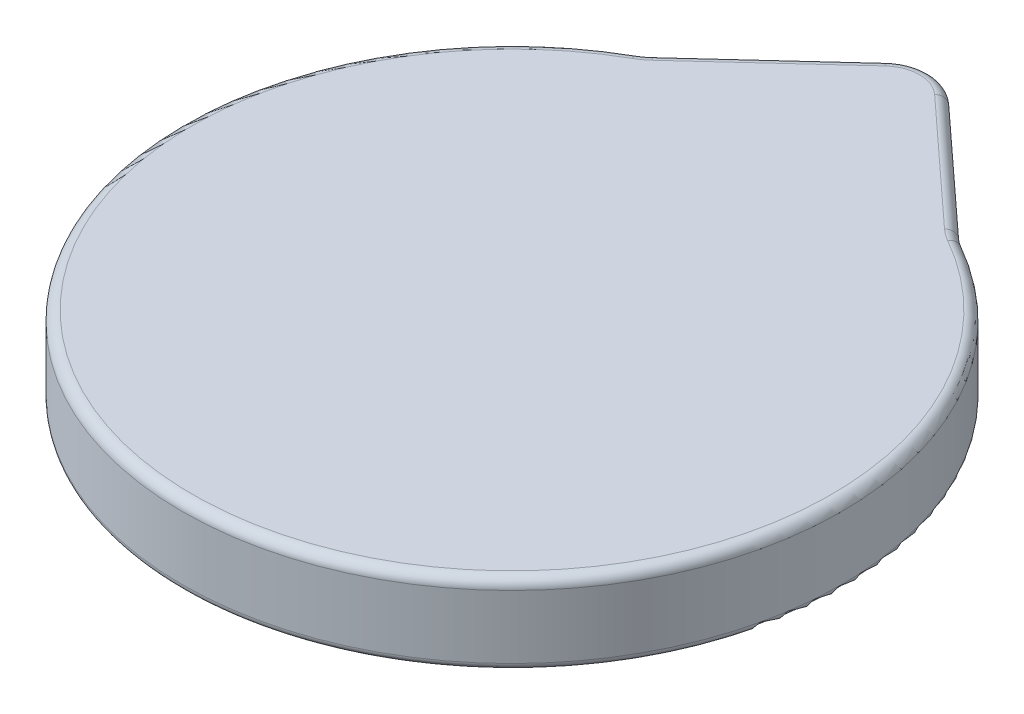
ISO-10303-21;
HEADER;
FILE_DESCRIPTION(('STEP AP214'),'2;1');
FILE_NAME('part.step','',(''),(''),'','','');
FILE_SCHEMA(('AUTOMOTIVE_DESIGN { 1 0 10303 214 1 1 1 1 }'));
ENDSEC;
DATA;
#1=APPLICATION_CONTEXT('core data for automotive mechanical design processes');
#2=APPLICATION_PROTOCOL_DEFINITION('international standard','automotive_design',2000,#1);
#3=PRODUCT_CONTEXT('',#1,'mechanical');
#4=PRODUCT('Part','Part','',(#3));
#5=PRODUCT_RELATED_PRODUCT_CATEGORY('part','',(#4));
#6=PRODUCT_DEFINITION_FORMATION('','',#4);
#7=PRODUCT_DEFINITION_CONTEXT('part definition',#1,'design');
#8=PRODUCT_DEFINITION('design','',#6,#7);
#9=PRODUCT_DEFINITION_SHAPE('','',#8);
#10=(LENGTH_UNIT() NAMED_UNIT(*) SI_UNIT(.MILLI.,.METRE.));
#11=(NAMED_UNIT(*) PLANE_ANGLE_UNIT() SI_UNIT($,.RADIAN.));
#12=(NAMED_UNIT(*) SI_UNIT($,.STERADIAN.) SOLID_ANGLE_UNIT());
#13=UNCERTAINTY_MEASURE_WITH_UNIT(LENGTH_MEASURE(1.E-05),#10,'distance_accuracy_value','');
#14=(GEOMETRIC_REPRESENTATION_CONTEXT(3) GLOBAL_UNCERTAINTY_ASSIGNED_CONTEXT((#13)) GLOBAL_UNIT_ASSIGNED_CONTEXT((#10,
#11,#12)) REPRESENTATION_CONTEXT('',''));
#15=CARTESIAN_POINT('',(0.,0.,0.));
#16=DIRECTION('',(0.,0.,1.));
#17=DIRECTION('',(1.,0.,0.));
#18=AXIS2_PLACEMENT_3D('',#15,#16,#17);
#19=CARTESIAN_POINT('',(-56.771821009574,-20.,-100.009801215965));
#20=DIRECTION('',(0.,1.,0.));
#21=DIRECTION('',(0.,0.,1.));
#22=AXIS2_PLACEMENT_3D('',#19,#20,#21);
#23=CYLINDRICAL_SURFACE('',#22,16.);
#24=DIRECTION('',(0.,1.,0.));
#25=VECTOR('',#24,1.);
#26=CARTESIAN_POINT('',(-45.9482804070128,-20.,-88.2262971180872));
#27=LINE('',#26,#25);
#28=CARTESIAN_POINT('',(-45.9482804070128,-18.,-88.2262971180872));
#29=VERTEX_POINT('',#28);
#30=CARTESIAN_POINT('',(-45.9482804070128,1.,-88.2262971180872));
#31=VERTEX_POINT('',#30);
#32=EDGE_CURVE('E292',#29,#31,#27,.T.);
#33=ORIENTED_EDGE('',*,*,#32,.F.);
#34=CARTESIAN_POINT('',(-56.771821009574,-18.,-100.009801215965));
#35=DIRECTION('',(0.,1.,0.));
#36=DIRECTION('',(0.,0.,1.));
#37=AXIS2_PLACEMENT_3D('',#34,#35,#36);
#38=CIRCLE('',#37,16.);
#39=CARTESIAN_POINT('',(-48.8731328691116,-18.,-86.0953940902658));
#40=VERTEX_POINT('',#39);
#41=EDGE_CURVE('E218',#29,#40,#38,.F.);
#42=ORIENTED_EDGE('',*,*,#41,.T.);
#43=DIRECTION('',(0.,1.,0.));
#44=VECTOR('',#43,1.);
#45=CARTESIAN_POINT('',(-48.8731328691116,-20.,-86.0953940902658));
#46=LINE('',#45,#44);
#47=CARTESIAN_POINT('',(-48.8731328691116,1.,-86.0953940902658));
#48=VERTEX_POINT('',#47);
#49=EDGE_CURVE('E312',#40,#48,#46,.T.);
#50=ORIENTED_EDGE('',*,*,#49,.T.);
#51=CARTESIAN_POINT('',(-56.771821009574,1.,-100.009801215965));
#52=DIRECTION('',(0.,1.,0.));
#53=DIRECTION('',(0.,0.,1.));
#54=AXIS2_PLACEMENT_3D('',#51,#52,#53);
#55=CIRCLE('',#54,16.);
#56=EDGE_CURVE('E298',#48,#31,#55,.T.);
#57=ORIENTED_EDGE('',*,*,#56,.T.);
#58=EDGE_LOOP('',(#33,#42,#50,#57));
#59=FACE_BOUND('',#58,.T.);
#60=ADVANCED_FACE('F37',(#59),#23,.F.);
#61=CARTESIAN_POINT('',(-9.4705980272411,-20.,-121.732262155761));
#62=DIRECTION('',(-0.676471287660074,0.,-0.73646900611738));
#63=DIRECTION('',(-0.73646900611738,0.,0.676471287660074));
#64=AXIS2_PLACEMENT_3D('',#61,#62,#63);
#65=PLANE('',#64);
#66=DIRECTION('',(0.,1.,0.));
#67=VECTOR('',#66,1.);
#68=CARTESIAN_POINT('',(-9.47059802724111,-20.,-121.732262155761));
#69=LINE('',#68,#67);
#70=CARTESIAN_POINT('',(-9.47059802724111,-18.,-121.732262155761));
#71=VERTEX_POINT('',#70);
#72=CARTESIAN_POINT('',(-9.47059802724111,1.,-121.732262155761));
#73=VERTEX_POINT('',#72);
#74=EDGE_CURVE('E206',#71,#73,#69,.T.);
#75=ORIENTED_EDGE('',*,*,#74,.F.);
#76=DIRECTION('',(-0.73646900611738,0.,0.676471287660074));
#77=VECTOR('',#76,1.);
#78=CARTESIAN_POINT('',(-45.9482804070128,-18.,-88.2262971180872));
#79=LINE('',#78,#77);
#80=EDGE_CURVE('E216',#71,#29,#79,.T.);
#81=ORIENTED_EDGE('',*,*,#80,.T.);
#82=ORIENTED_EDGE('',*,*,#32,.T.);
#83=DIRECTION('',(-0.73646900611738,0.,0.676471287660074));
#84=VECTOR('',#83,1.);
#85=CARTESIAN_POINT('',(-9.4705980272411,1.,-121.732262155761));
#86=LINE('',#85,#84);
#87=EDGE_CURVE('E372',#31,#73,#86,.F.);
#88=ORIENTED_EDGE('',*,*,#87,.T.);
#89=EDGE_LOOP('',(#75,#81,#82,#88));
#90=FACE_BOUND('',#89,.T.);
#91=ADVANCED_FACE('F290',(#90),#65,.T.);
#92=CARTESIAN_POINT('',(0.,-20.,-111.421696070118));
#93=DIRECTION('',(0.,1.,0.));
#94=DIRECTION('',(0.,0.,1.));
#95=AXIS2_PLACEMENT_3D('',#92,#93,#94);
#96=CYLINDRICAL_SURFACE('',#95,14.);
#97=DIRECTION('',(0.,1.,0.));
#98=VECTOR('',#97,1.);
#99=CARTESIAN_POINT('',(9.47059802724109,-20.,-121.732262155761));
#100=LINE('',#99,#98);
#101=CARTESIAN_POINT('',(9.47059802724109,-18.,-121.732262155761));
#102=VERTEX_POINT('',#101);
#103=CARTESIAN_POINT('',(9.47059802724109,1.,-121.732262155761));
#104=VERTEX_POINT('',#103);
#105=EDGE_CURVE('E194',#102,#104,#100,.T.);
#106=ORIENTED_EDGE('',*,*,#105,.F.);
#107=CARTESIAN_POINT('',(0.,-18.,-111.421696070118));
#108=DIRECTION('',(0.,1.,0.));
#109=DIRECTION('',(0.,0.,1.));
#110=AXIS2_PLACEMENT_3D('',#107,#108,#109);
#111=CIRCLE('',#110,14.);
#112=EDGE_CURVE('E198',#102,#71,#111,.T.);
#113=ORIENTED_EDGE('',*,*,#112,.T.);
#114=ORIENTED_EDGE('',*,*,#74,.T.);
#115=CARTESIAN_POINT('',(0.,1.,-111.421696070118));
#116=DIRECTION('',(0.,1.,0.));
#117=DIRECTION('',(0.,0.,1.));
#118=AXIS2_PLACEMENT_3D('',#115,#116,#117);
#119=CIRCLE('',#118,14.);
#120=EDGE_CURVE('E204',#73,#104,#119,.F.);
#121=ORIENTED_EDGE('',*,*,#120,.T.);
#122=EDGE_LOOP('',(#106,#113,#114,#121));
#123=FACE_BOUND('',#122,.T.);
#124=ADVANCED_FACE('F201',(#123),#96,.T.);
#125=CARTESIAN_POINT('',(9.47059802724109,-20.,-121.732262155761));
#126=DIRECTION('',(0.676471287660074,0.,-0.73646900611738));
#127=DIRECTION('',(-0.73646900611738,0.,-0.676471287660074));
#128=AXIS2_PLACEMENT_3D('',#125,#126,#127);
#129=PLANE('',#128);
#130=DIRECTION('',(0.,1.,0.));
#131=VECTOR('',#130,1.);
#132=CARTESIAN_POINT('',(45.9482804070129,-20.,-88.2262971180872));
#133=LINE('',#132,#131);
#134=CARTESIAN_POINT('',(45.9482804070129,-18.,-88.2262971180872));
#135=VERTEX_POINT('',#134);
#136=CARTESIAN_POINT('',(45.9482804070129,1.,-88.2262971180872));
#137=VERTEX_POINT('',#136);
#138=EDGE_CURVE('E196',#135,#137,#133,.T.);
#139=ORIENTED_EDGE('',*,*,#138,.F.);
#140=DIRECTION('',(-0.73646900611738,0.,-0.676471287660074));
#141=VECTOR('',#140,1.);
#142=CARTESIAN_POINT('',(9.47059802724109,-18.,-121.732262155761));
#143=LINE('',#142,#141);
#144=EDGE_CURVE('E190',#135,#102,#143,.T.);
#145=ORIENTED_EDGE('',*,*,#144,.T.);
#146=ORIENTED_EDGE('',*,*,#105,.T.);
#147=DIRECTION('',(0.73646900611738,0.,0.676471287660074));
#148=VECTOR('',#147,1.);
#149=CARTESIAN_POINT('',(9.47059802724109,1.,-121.732262155761));
#150=LINE('',#149,#148);
#151=EDGE_CURVE('E375',#104,#137,#150,.T.);
#152=ORIENTED_EDGE('',*,*,#151,.T.);
#153=EDGE_LOOP('',(#139,#145,#146,#152));
#154=FACE_BOUND('',#153,.T.);
#155=ADVANCED_FACE('F192',(#154),#129,.T.);
#156=CARTESIAN_POINT('',(56.7718210095741,-20.,-100.009801215965));
#157=DIRECTION('',(0.,1.,0.));
#158=DIRECTION('',(0.,0.,1.));
#159=AXIS2_PLACEMENT_3D('',#156,#157,#158);
#160=CYLINDRICAL_SURFACE('',#159,16.);
#161=DIRECTION('',(0.,1.,0.));
#162=VECTOR('',#161,1.);
#163=CARTESIAN_POINT('',(48.8731328691116,-20.,-86.0953940902657));
#164=LINE('',#163,#162);
#165=CARTESIAN_POINT('',(48.8731328691116,-18.,-86.0953940902657));
#166=VERTEX_POINT('',#165);
#167=CARTESIAN_POINT('',(48.8731328691116,1.,-86.0953940902657));
#168=VERTEX_POINT('',#167);
#169=EDGE_CURVE('E310',#166,#168,#164,.T.);
#170=ORIENTED_EDGE('',*,*,#169,.F.);
#171=CARTESIAN_POINT('',(56.7718210095741,-18.,-100.009801215965));
#172=DIRECTION('',(0.,1.,0.));
#173=DIRECTION('',(0.,0.,1.));
#174=AXIS2_PLACEMENT_3D('',#171,#172,#173);
#175=CIRCLE('',#174,16.);
#176=EDGE_CURVE('E197',#166,#135,#175,.F.);
#177=ORIENTED_EDGE('',*,*,#176,.T.);
#178=ORIENTED_EDGE('',*,*,#138,.T.);
#179=CARTESIAN_POINT('',(56.7718210095741,1.,-100.009801215965));
#180=DIRECTION('',(0.,1.,0.));
#181=DIRECTION('',(0.,0.,1.));
#182=AXIS2_PLACEMENT_3D('',#179,#180,#181);
#183=CIRCLE('',#182,16.);
#184=EDGE_CURVE('E377',#137,#168,#183,.T.);
#185=ORIENTED_EDGE('',*,*,#184,.T.);
#186=EDGE_LOOP('',(#170,#177,#178,#185));
#187=FACE_BOUND('',#186,.T.);
#188=ADVANCED_FACE('F741',(#187),#160,.F.);
#189=CARTESIAN_POINT('',(0.,-20.,0.));
#190=DIRECTION('',(0.,1.,0.));
#191=DIRECTION('',(0.,0.,1.));
#192=AXIS2_PLACEMENT_3D('',#189,#190,#191);
#193=CYLINDRICAL_SURFACE('',#192,99.);
#194=ORIENTED_EDGE('',*,*,#49,.F.);
#195=CARTESIAN_POINT('',(0.,-18.,0.));
#196=DIRECTION('',(0.,1.,0.));
#197=DIRECTION('',(0.,0.,1.));
#198=AXIS2_PLACEMENT_3D('',#195,#196,#197);
#199=CIRCLE('',#198,99.);
#200=EDGE_CURVE('E11',#40,#166,#199,.T.);
#201=ORIENTED_EDGE('',*,*,#200,.T.);
#202=ORIENTED_EDGE('',*,*,#169,.T.);
#203=CARTESIAN_POINT('',(0.,1.,0.));
#204=DIRECTION('',(0.,1.,0.));
#205=DIRECTION('',(0.,0.,1.));
#206=AXIS2_PLACEMENT_3D('',#203,#204,#205);
#207=CIRCLE('',#206,99.);
#208=EDGE_CURVE('E380',#168,#48,#207,.F.);
#209=ORIENTED_EDGE('',*,*,#208,.T.);
#210=EDGE_LOOP('',(#194,#201,#202,#209));
#211=FACE_BOUND('',#210,.T.);
#212=ADVANCED_FACE('F482',(#211),#193,.T.);
#213=CARTESIAN_POINT('',(56.7718210095741,-20.,-100.009801215965));
#214=DIRECTION('',(0.,1.,0.));
#215=DIRECTION('',(0.,0.,1.));
#216=AXIS2_PLACEMENT_3D('',#213,#214,#215);
#217=CYLINDRICAL_SURFACE('',#216,20.);
#218=DIRECTION('',(0.,1.,0.));
#219=VECTOR('',#218,1.);
#220=CARTESIAN_POINT('',(43.2423952563726,-20.,-85.2804210936177));
#221=LINE('',#220,#219);
#222=CARTESIAN_POINT('',(43.2423952563726,-18.,-85.2804210936177));
#223=VERTEX_POINT('',#222);
#224=CARTESIAN_POINT('',(43.2423952563726,-4.,-85.2804210936177));
#225=VERTEX_POINT('',#224);
#226=EDGE_CURVE('E306',#223,#225,#221,.T.);
#227=ORIENTED_EDGE('',*,*,#226,.F.);
#228=CARTESIAN_POINT('',(56.7718210095741,-18.,-100.009801215965));
#229=DIRECTION('',(0.,1.,0.));
#230=DIRECTION('',(0.,0.,1.));
#231=AXIS2_PLACEMENT_3D('',#228,#229,#230);
#232=CIRCLE('',#231,20.);
#233=CARTESIAN_POINT('',(46.898460833996,-18.,-82.6167923088409));
#234=VERTEX_POINT('',#233);
#235=EDGE_CURVE('E275',#223,#234,#232,.T.);
#236=ORIENTED_EDGE('',*,*,#235,.T.);
#237=DIRECTION('',(0.,1.,0.));
#238=VECTOR('',#237,1.);
#239=CARTESIAN_POINT('',(46.898460833996,-20.,-82.6167923088409));
#240=LINE('',#239,#238);
#241=CARTESIAN_POINT('',(46.898460833996,-4.,-82.6167923088409));
#242=VERTEX_POINT('',#241);
#243=EDGE_CURVE('E313',#234,#242,#240,.T.);
#244=ORIENTED_EDGE('',*,*,#243,.T.);
#245=CARTESIAN_POINT('',(56.7718210095741,-4.,-100.009801215965));
#246=DIRECTION('',(0.,1.,0.));
#247=DIRECTION('',(0.,0.,1.));
#248=AXIS2_PLACEMENT_3D('',#245,#246,#247);
#249=CIRCLE('',#248,20.);
#250=EDGE_CURVE('E336',#242,#225,#249,.F.);
#251=ORIENTED_EDGE('',*,*,#250,.T.);
#252=EDGE_LOOP('',(#227,#236,#244,#251));
#253=FACE_BOUND('',#252,.T.);
#254=ADVANCED_FACE('F408',(#253),#217,.T.);
#255=CARTESIAN_POINT('',(0.,-20.,0.));
#256=DIRECTION('',(0.,1.,0.));
#257=DIRECTION('',(0.,0.,1.));
#258=AXIS2_PLACEMENT_3D('',#255,#256,#257);
#259=CYLINDRICAL_SURFACE('',#258,95.);
#260=ORIENTED_EDGE('',*,*,#243,.F.);
#261=CARTESIAN_POINT('',(0.,-18.,0.));
#262=DIRECTION('',(0.,1.,0.));
#263=DIRECTION('',(0.,0.,1.));
#264=AXIS2_PLACEMENT_3D('',#261,#262,#263);
#265=CIRCLE('',#264,95.);
#266=CARTESIAN_POINT('',(-46.8984608339959,-18.,-82.6167923088409));
#267=VERTEX_POINT('',#266);
#268=EDGE_CURVE('E47',#234,#267,#265,.F.);
#269=ORIENTED_EDGE('',*,*,#268,.T.);
#270=DIRECTION('',(0.,1.,0.));
#271=VECTOR('',#270,1.);
#272=CARTESIAN_POINT('',(-46.8984608339959,-20.,-82.6167923088409));
#273=LINE('',#272,#271);
#274=CARTESIAN_POINT('',(-46.8984608339959,-4.,-82.6167923088409));
#275=VERTEX_POINT('',#274);
#276=EDGE_CURVE('E92',#267,#275,#273,.T.);
#277=ORIENTED_EDGE('',*,*,#276,.T.);
#278=CARTESIAN_POINT('',(0.,-4.,0.));
#279=DIRECTION('',(0.,1.,0.));
#280=DIRECTION('',(0.,0.,1.));
#281=AXIS2_PLACEMENT_3D('',#278,#279,#280);
#282=CIRCLE('',#281,95.);
#283=EDGE_CURVE('E339',#275,#242,#282,.T.);
#284=ORIENTED_EDGE('',*,*,#283,.T.);
#285=EDGE_LOOP('',(#260,#269,#277,#284));
#286=FACE_BOUND('',#285,.T.);
#287=ADVANCED_FACE('F409',(#286),#259,.F.);
#288=CARTESIAN_POINT('',(-56.771821009574,-20.,-100.009801215965));
#289=DIRECTION('',(0.,1.,0.));
#290=DIRECTION('',(0.,0.,1.));
#291=AXIS2_PLACEMENT_3D('',#288,#289,#290);
#292=CYLINDRICAL_SURFACE('',#291,20.);
#293=ORIENTED_EDGE('',*,*,#276,.F.);
#294=CARTESIAN_POINT('',(-56.771821009574,-18.,-100.009801215965));
#295=DIRECTION('',(0.,1.,0.));
#296=DIRECTION('',(0.,0.,1.));
#297=AXIS2_PLACEMENT_3D('',#294,#295,#296);
#298=CIRCLE('',#297,20.);
#299=CARTESIAN_POINT('',(-43.2423952563726,-18.,-85.2804210936177));
#300=VERTEX_POINT('',#299);
#301=EDGE_CURVE('E383',#267,#300,#298,.T.);
#302=ORIENTED_EDGE('',*,*,#301,.T.);
#303=DIRECTION('',(0.,1.,0.));
#304=VECTOR('',#303,1.);
#305=CARTESIAN_POINT('',(-43.2423952563726,-20.,-85.2804210936177));
#306=LINE('',#305,#304);
#307=CARTESIAN_POINT('',(-43.2423952563726,-4.,-85.2804210936177));
#308=VERTEX_POINT('',#307);
#309=EDGE_CURVE('E426',#300,#308,#306,.T.);
#310=ORIENTED_EDGE('',*,*,#309,.T.);
#311=CARTESIAN_POINT('',(-56.771821009574,-4.,-100.009801215965));
#312=DIRECTION('',(0.,1.,0.));
#313=DIRECTION('',(0.,0.,1.));
#314=AXIS2_PLACEMENT_3D('',#311,#312,#313);
#315=CIRCLE('',#314,20.);
#316=EDGE_CURVE('E299',#308,#275,#315,.F.);
#317=ORIENTED_EDGE('',*,*,#316,.T.);
#318=EDGE_LOOP('',(#293,#302,#310,#317));
#319=FACE_BOUND('',#318,.T.);
#320=ADVANCED_FACE('F425',(#319),#292,.T.);
#321=CARTESIAN_POINT('',(-6.76471287660079,-20.,-118.786386131292));
#322=DIRECTION('',(-0.676471287660074,0.,-0.73646900611738));
#323=DIRECTION('',(-0.73646900611738,0.,0.676471287660074));
#324=AXIS2_PLACEMENT_3D('',#321,#322,#323);
#325=PLANE('',#324);
#326=ORIENTED_EDGE('',*,*,#309,.F.);
#327=DIRECTION('',(-0.73646900611738,0.,0.676471287660074));
#328=VECTOR('',#327,1.);
#329=CARTESIAN_POINT('',(-6.76471287660079,-18.,-118.786386131292));
#330=LINE('',#329,#328);
#331=CARTESIAN_POINT('',(-6.76471287660079,-18.,-118.786386131292));
#332=VERTEX_POINT('',#331);
#333=EDGE_CURVE('E400',#300,#332,#330,.F.);
#334=ORIENTED_EDGE('',*,*,#333,.T.);
#335=DIRECTION('',(0.,1.,0.));
#336=VECTOR('',#335,1.);
#337=CARTESIAN_POINT('',(-6.76471287660079,-20.,-118.786386131292));
#338=LINE('',#337,#336);
#339=CARTESIAN_POINT('',(-6.76471287660079,-4.,-118.786386131292));
#340=VERTEX_POINT('',#339);
#341=EDGE_CURVE('E432',#332,#340,#338,.T.);
#342=ORIENTED_EDGE('',*,*,#341,.T.);
#343=DIRECTION('',(-0.73646900611738,0.,0.676471287660074));
#344=VECTOR('',#343,1.);
#345=CARTESIAN_POINT('',(-43.2423952563726,-4.,-85.2804210936177));
#346=LINE('',#345,#344);
#347=EDGE_CURVE('E327',#340,#308,#346,.T.);
#348=ORIENTED_EDGE('',*,*,#347,.T.);
#349=EDGE_LOOP('',(#326,#334,#342,#348));
#350=FACE_BOUND('',#349,.T.);
#351=ADVANCED_FACE('F428',(#350),#325,.F.);
#352=CARTESIAN_POINT('',(0.,-20.,-111.421696070118));
#353=DIRECTION('',(0.,1.,0.));
#354=DIRECTION('',(0.,0.,1.));
#355=AXIS2_PLACEMENT_3D('',#352,#353,#354);
#356=CYLINDRICAL_SURFACE('',#355,10.);
#357=ORIENTED_EDGE('',*,*,#341,.F.);
#358=CARTESIAN_POINT('',(0.,-18.,-111.421696070118));
#359=DIRECTION('',(0.,1.,0.));
#360=DIRECTION('',(0.,0.,1.));
#361=AXIS2_PLACEMENT_3D('',#358,#359,#360);
#362=CIRCLE('',#361,10.);
#363=CARTESIAN_POINT('',(6.76471287660079,-18.,-118.786386131292));
#364=VERTEX_POINT('',#363);
#365=EDGE_CURVE('E402',#332,#364,#362,.F.);
#366=ORIENTED_EDGE('',*,*,#365,.T.);
#367=DIRECTION('',(0.,1.,0.));
#368=VECTOR('',#367,1.);
#369=CARTESIAN_POINT('',(6.76471287660079,-20.,-118.786386131292));
#370=LINE('',#369,#368);
#371=CARTESIAN_POINT('',(6.76471287660079,-4.,-118.786386131292));
#372=VERTEX_POINT('',#371);
#373=EDGE_CURVE('E435',#364,#372,#370,.T.);
#374=ORIENTED_EDGE('',*,*,#373,.T.);
#375=CARTESIAN_POINT('',(0.,-4.,-111.421696070118));
#376=DIRECTION('',(0.,1.,0.));
#377=DIRECTION('',(0.,0.,1.));
#378=AXIS2_PLACEMENT_3D('',#375,#376,#377);
#379=CIRCLE('',#378,10.);
#380=EDGE_CURVE('E330',#372,#340,#379,.T.);
#381=ORIENTED_EDGE('',*,*,#380,.T.);
#382=EDGE_LOOP('',(#357,#366,#374,#381));
#383=FACE_BOUND('',#382,.T.);
#384=ADVANCED_FACE('F460',(#383),#356,.F.);
#385=CARTESIAN_POINT('',(6.76471287660079,-20.,-118.786386131292));
#386=DIRECTION('',(0.676471287660074,0.,-0.73646900611738));
#387=DIRECTION('',(-0.73646900611738,0.,-0.676471287660074));
#388=AXIS2_PLACEMENT_3D('',#385,#386,#387);
#389=PLANE('',#388);
#390=ORIENTED_EDGE('',*,*,#373,.F.);
#391=DIRECTION('',(-0.73646900611738,0.,-0.676471287660074));
#392=VECTOR('',#391,1.);
#393=CARTESIAN_POINT('',(6.76471287660079,-18.,-118.786386131292));
#394=LINE('',#393,#392);
#395=EDGE_CURVE('E279',#364,#223,#394,.F.);
#396=ORIENTED_EDGE('',*,*,#395,.T.);
#397=ORIENTED_EDGE('',*,*,#226,.T.);
#398=DIRECTION('',(-0.73646900611738,0.,-0.676471287660074));
#399=VECTOR('',#398,1.);
#400=CARTESIAN_POINT('',(6.76471287660079,-4.,-118.786386131292));
#401=LINE('',#400,#399);
#402=EDGE_CURVE('E333',#225,#372,#401,.T.);
#403=ORIENTED_EDGE('',*,*,#402,.T.);
#404=EDGE_LOOP('',(#390,#396,#397,#403));
#405=FACE_BOUND('',#404,.T.);
#406=ADVANCED_FACE('F440',(#405),#389,.F.);
#407=CARTESIAN_POINT('',(-56.771821009574,0.,-100.009801215965));
#408=DIRECTION('',(0.,1.,0.));
#409=DIRECTION('',(0.,0.,1.));
#410=AXIS2_PLACEMENT_3D('',#407,#408,#409);
#411=PLANE('',#410);
#412=CARTESIAN_POINT('',(0.,0.,0.));
#413=DIRECTION('',(0.,1.,0.));
#414=DIRECTION('',(0.,0.,1.));
#415=AXIS2_PLACEMENT_3D('',#412,#413,#414);
#416=CIRCLE('',#415,91.);
#417=CARTESIAN_POINT('',(44.9237887988804,0.,-79.138190527416));
#418=VERTEX_POINT('',#417);
#419=CARTESIAN_POINT('',(-44.9237887988803,0.,-79.138190527416));
#420=VERTEX_POINT('',#419);
#421=EDGE_CURVE('E302',#418,#420,#416,.F.);
#422=ORIENTED_EDGE('',*,*,#421,.T.);
#423=CARTESIAN_POINT('',(-56.771821009574,0.,-100.009801215965));
#424=DIRECTION('',(0.,1.,0.));
#425=DIRECTION('',(0.,0.,1.));
#426=AXIS2_PLACEMENT_3D('',#423,#424,#425);
#427=CIRCLE('',#426,24.);
#428=CARTESIAN_POINT('',(-40.5365101057323,0.,-82.3345450691481));
#429=VERTEX_POINT('',#428);
#430=EDGE_CURVE('E324',#420,#429,#427,.T.);
#431=ORIENTED_EDGE('',*,*,#430,.T.);
#432=DIRECTION('',(-0.73646900611738,0.,0.676471287660074));
#433=VECTOR('',#432,1.);
#434=CARTESIAN_POINT('',(-4.05882772596049,0.,-115.840510106822));
#435=LINE('',#434,#433);
#436=CARTESIAN_POINT('',(-4.0588277259605,0.,-115.840510106822));
#437=VERTEX_POINT('',#436);
#438=EDGE_CURVE('E322',#429,#437,#435,.F.);
#439=ORIENTED_EDGE('',*,*,#438,.T.);
#440=CARTESIAN_POINT('',(0.,0.,-111.421696070118));
#441=DIRECTION('',(0.,1.,0.));
#442=DIRECTION('',(0.,0.,1.));
#443=AXIS2_PLACEMENT_3D('',#440,#441,#442);
#444=CIRCLE('',#443,6.);
#445=CARTESIAN_POINT('',(4.05882772596047,0.,-115.840510106822));
#446=VERTEX_POINT('',#445);
#447=EDGE_CURVE('E320',#437,#446,#444,.F.);
#448=ORIENTED_EDGE('',*,*,#447,.T.);
#449=DIRECTION('',(-0.73646900611738,0.,-0.676471287660074));
#450=VECTOR('',#449,1.);
#451=CARTESIAN_POINT('',(40.5365101057323,0.,-82.3345450691481));
#452=LINE('',#451,#450);
#453=CARTESIAN_POINT('',(40.5365101057323,0.,-82.3345450691481));
#454=VERTEX_POINT('',#453);
#455=EDGE_CURVE('E318',#446,#454,#452,.F.);
#456=ORIENTED_EDGE('',*,*,#455,.T.);
#457=CARTESIAN_POINT('',(56.7718210095741,0.,-100.009801215965));
#458=DIRECTION('',(0.,1.,0.));
#459=DIRECTION('',(0.,0.,1.));
#460=AXIS2_PLACEMENT_3D('',#457,#458,#459);
#461=CIRCLE('',#460,24.);
#462=EDGE_CURVE('E316',#454,#418,#461,.T.);
#463=ORIENTED_EDGE('',*,*,#462,.T.);
#464=EDGE_LOOP('',(#422,#431,#439,#448,#456,#463));
#465=FACE_BOUND('',#464,.T.);
#466=ADVANCED_FACE('F454',(#465),#411,.F.);
#467=CARTESIAN_POINT('',(-56.771821009574,4.,-100.009801215965));
#468=DIRECTION('',(0.,1.,0.));
#469=DIRECTION('',(0.,0.,1.));
#470=AXIS2_PLACEMENT_3D('',#467,#468,#469);
#471=PLANE('',#470);
#472=DIRECTION('',(-0.73646900611738,0.,0.676471287660074));
#473=VECTOR('',#472,1.);
#474=CARTESIAN_POINT('',(-43.9188665440326,4.,-86.0168900997351));
#475=LINE('',#474,#473);
#476=CARTESIAN_POINT('',(-7.44118416426088,4.,-119.522855137409));
#477=VERTEX_POINT('',#476);
#478=CARTESIAN_POINT('',(-43.9188665440326,4.,-86.0168900997351));
#479=VERTEX_POINT('',#478);
#480=EDGE_CURVE('E367',#477,#479,#475,.T.);
#481=ORIENTED_EDGE('',*,*,#480,.T.);
#482=CARTESIAN_POINT('',(-56.771821009574,4.,-100.009801215965));
#483=DIRECTION('',(0.,1.,0.));
#484=DIRECTION('',(0.,0.,1.));
#485=AXIS2_PLACEMENT_3D('',#482,#483,#484);
#486=CIRCLE('',#485,19.);
#487=CARTESIAN_POINT('',(-47.3921288427749,4.,-83.4864427541971));
#488=VERTEX_POINT('',#487);
#489=EDGE_CURVE('E369',#479,#488,#486,.F.);
#490=ORIENTED_EDGE('',*,*,#489,.T.);
#491=CARTESIAN_POINT('',(0.,4.,0.));
#492=DIRECTION('',(0.,1.,0.));
#493=DIRECTION('',(0.,0.,1.));
#494=AXIS2_PLACEMENT_3D('',#491,#492,#493);
#495=CIRCLE('',#494,96.);
#496=CARTESIAN_POINT('',(47.3921288427749,4.,-83.4864427541971));
#497=VERTEX_POINT('',#496);
#498=EDGE_CURVE('E359',#488,#497,#495,.T.);
#499=ORIENTED_EDGE('',*,*,#498,.T.);
#500=CARTESIAN_POINT('',(56.7718210095741,4.,-100.009801215965));
#501=DIRECTION('',(0.,1.,0.));
#502=DIRECTION('',(0.,0.,1.));
#503=AXIS2_PLACEMENT_3D('',#500,#501,#502);
#504=CIRCLE('',#503,19.);
#505=CARTESIAN_POINT('',(43.9188665440327,4.,-86.0168900997351));
#506=VERTEX_POINT('',#505);
#507=EDGE_CURVE('E361',#497,#506,#504,.F.);
#508=ORIENTED_EDGE('',*,*,#507,.T.);
#509=DIRECTION('',(0.73646900611738,0.,0.676471287660074));
#510=VECTOR('',#509,1.);
#511=CARTESIAN_POINT('',(-17.6656830584857,4.,-142.584348096659));
#512=LINE('',#511,#510);
#513=CARTESIAN_POINT('',(7.44118416426086,4.,-119.522855137409));
#514=VERTEX_POINT('',#513);
#515=EDGE_CURVE('E363',#506,#514,#512,.F.);
#516=ORIENTED_EDGE('',*,*,#515,.T.);
#517=CARTESIAN_POINT('',(0.,4.,-111.421696070118));
#518=DIRECTION('',(0.,1.,0.));
#519=DIRECTION('',(0.,0.,1.));
#520=AXIS2_PLACEMENT_3D('',#517,#518,#519);
#521=CIRCLE('',#520,11.);
#522=EDGE_CURVE('E365',#514,#477,#521,.T.);
#523=ORIENTED_EDGE('',*,*,#522,.T.);
#524=EDGE_LOOP('',(#481,#490,#499,#508,#516,#523));
#525=FACE_BOUND('',#524,.T.);
#526=ADVANCED_FACE('F503',(#525),#471,.T.);
#527=CARTESIAN_POINT('',(4.0588277259605,-4.,-115.840510106822));
#528=DIRECTION('',(0.73646900611738,0.,0.676471287660074));
#529=DIRECTION('',(0.676471287660074,0.,-0.73646900611738));
#530=AXIS2_PLACEMENT_3D('',#527,#528,#529);
#531=CYLINDRICAL_SURFACE('',#530,4.);
#532=CARTESIAN_POINT('',(40.5365101057323,-4.,-82.3345450691481));
#533=DIRECTION('',(-0.73646900611738,0.,-0.676471287660074));
#534=DIRECTION('',(-0.676471287660074,0.,0.73646900611738));
#535=AXIS2_PLACEMENT_3D('',#532,#533,#534);
#536=CIRCLE('',#535,4.);
#537=EDGE_CURVE('E352',#454,#225,#536,.T.);
#538=ORIENTED_EDGE('',*,*,#537,.F.);
#539=ORIENTED_EDGE('',*,*,#455,.F.);
#540=CARTESIAN_POINT('',(4.0588277259605,-4.,-115.840510106822));
#541=DIRECTION('',(0.73646900611738,0.,0.676471287660074));
#542=DIRECTION('',(0.676471287660074,0.,-0.73646900611738));
#543=AXIS2_PLACEMENT_3D('',#540,#541,#542);
#544=CIRCLE('',#543,4.);
#545=EDGE_CURVE('E355',#372,#446,#544,.T.);
#546=ORIENTED_EDGE('',*,*,#545,.F.);
#547=ORIENTED_EDGE('',*,*,#402,.F.);
#548=EDGE_LOOP('',(#538,#539,#546,#547));
#549=FACE_BOUND('',#548,.T.);
#550=ADVANCED_FACE('F447',(#549),#531,.F.);
#551=CARTESIAN_POINT('',(0.,-4.,-111.421696070118));
#552=DIRECTION('',(0.,1.,0.));
#553=DIRECTION('',(0.,0.,1.));
#554=AXIS2_PLACEMENT_3D('',#551,#552,#553);
#555=TOROIDAL_SURFACE('',#554,6.,4.);
#556=ORIENTED_EDGE('',*,*,#545,.T.);
#557=ORIENTED_EDGE('',*,*,#447,.F.);
#558=CARTESIAN_POINT('',(-4.05882772596047,-4.,-115.840510106822));
#559=DIRECTION('',(0.736469006117375,0.,-0.67647128766008));
#560=DIRECTION('',(-0.67647128766008,0.,-0.736469006117375));
#561=AXIS2_PLACEMENT_3D('',#558,#559,#560);
#562=CIRCLE('',#561,4.);
#563=EDGE_CURVE('E349',#340,#437,#562,.T.);
#564=ORIENTED_EDGE('',*,*,#563,.F.);
#565=ORIENTED_EDGE('',*,*,#380,.F.);
#566=EDGE_LOOP('',(#556,#557,#564,#565));
#567=FACE_BOUND('',#566,.T.);
#568=ADVANCED_FACE('F458',(#567),#555,.F.);
#569=CARTESIAN_POINT('',(56.7718210095741,-4.,-100.009801215965));
#570=DIRECTION('',(0.,1.,0.));
#571=DIRECTION('',(0.,0.,1.));
#572=AXIS2_PLACEMENT_3D('',#569,#570,#571);
#573=TOROIDAL_SURFACE('',#572,24.,4.);
#574=ORIENTED_EDGE('',*,*,#537,.T.);
#575=ORIENTED_EDGE('',*,*,#250,.F.);
#576=CARTESIAN_POINT('',(44.9237887988804,-4.,-79.138190527416));
#577=DIRECTION('',(-0.869650445356221,0.,-0.493668008778902));
#578=DIRECTION('',(-0.493668008778902,0.,0.869650445356221));
#579=AXIS2_PLACEMENT_3D('',#576,#577,#578);
#580=CIRCLE('',#579,4.);
#581=EDGE_CURVE('E346',#418,#242,#580,.T.);
#582=ORIENTED_EDGE('',*,*,#581,.F.);
#583=ORIENTED_EDGE('',*,*,#462,.F.);
#584=EDGE_LOOP('',(#574,#575,#582,#583));
#585=FACE_BOUND('',#584,.T.);
#586=ADVANCED_FACE('F451',(#585),#573,.F.);
#587=CARTESIAN_POINT('',(-4.05882772596049,-4.,-115.840510106822));
#588=DIRECTION('',(0.73646900611738,0.,-0.676471287660074));
#589=DIRECTION('',(-0.676471287660074,0.,-0.73646900611738));
#590=AXIS2_PLACEMENT_3D('',#587,#588,#589);
#591=CYLINDRICAL_SURFACE('',#590,4.);
#592=ORIENTED_EDGE('',*,*,#563,.T.);
#593=ORIENTED_EDGE('',*,*,#438,.F.);
#594=CARTESIAN_POINT('',(-40.5365101057323,-4.,-82.3345450691481));
#595=DIRECTION('',(0.73646900611738,0.,-0.676471287660074));
#596=DIRECTION('',(-0.676471287660074,0.,-0.73646900611738));
#597=AXIS2_PLACEMENT_3D('',#594,#595,#596);
#598=CIRCLE('',#597,4.);
#599=EDGE_CURVE('E343',#308,#429,#598,.T.);
#600=ORIENTED_EDGE('',*,*,#599,.F.);
#601=ORIENTED_EDGE('',*,*,#347,.F.);
#602=EDGE_LOOP('',(#592,#593,#600,#601));
#603=FACE_BOUND('',#602,.T.);
#604=ADVANCED_FACE('F492',(#603),#591,.F.);
#605=CARTESIAN_POINT('',(0.,-4.,0.));
#606=DIRECTION('',(0.,1.,0.));
#607=DIRECTION('',(0.,0.,1.));
#608=AXIS2_PLACEMENT_3D('',#605,#606,#607);
#609=TOROIDAL_SURFACE('',#608,91.,4.);
#610=ORIENTED_EDGE('',*,*,#581,.T.);
#611=ORIENTED_EDGE('',*,*,#283,.F.);
#612=CARTESIAN_POINT('',(-44.9237887988803,-4.,-79.138190527416));
#613=DIRECTION('',(-0.86965044535622,0.,0.493668008778905));
#614=DIRECTION('',(0.493668008778905,0.,0.86965044535622));
#615=AXIS2_PLACEMENT_3D('',#612,#613,#614);
#616=CIRCLE('',#615,4.);
#617=EDGE_CURVE('E341',#420,#275,#616,.T.);
#618=ORIENTED_EDGE('',*,*,#617,.F.);
#619=ORIENTED_EDGE('',*,*,#421,.F.);
#620=EDGE_LOOP('',(#610,#611,#618,#619));
#621=FACE_BOUND('',#620,.T.);
#622=ADVANCED_FACE('F488',(#621),#609,.F.);
#623=CARTESIAN_POINT('',(-56.771821009574,-4.,-100.009801215965));
#624=DIRECTION('',(0.,1.,0.));
#625=DIRECTION('',(0.,0.,1.));
#626=AXIS2_PLACEMENT_3D('',#623,#624,#625);
#627=TOROIDAL_SURFACE('',#626,24.,4.);
#628=ORIENTED_EDGE('',*,*,#599,.T.);
#629=ORIENTED_EDGE('',*,*,#430,.F.);
#630=ORIENTED_EDGE('',*,*,#617,.T.);
#631=ORIENTED_EDGE('',*,*,#316,.F.);
#632=EDGE_LOOP('',(#628,#629,#630,#631));
#633=FACE_BOUND('',#632,.T.);
#634=ADVANCED_FACE('F484',(#633),#627,.F.);
#635=CARTESIAN_POINT('',(7.44118416426087,1.,-119.522855137409));
#636=DIRECTION('',(0.73646900611738,0.,0.676471287660074));
#637=DIRECTION('',(0.676471287660074,0.,-0.73646900611738));
#638=AXIS2_PLACEMENT_3D('',#635,#636,#637);
#639=CYLINDRICAL_SURFACE('',#638,3.);
#640=CARTESIAN_POINT('',(7.44118416426086,1.,-119.522855137409));
#641=DIRECTION('',(-0.736469006117379,0.,-0.676471287660075));
#642=DIRECTION('',(-0.676471287660075,0.,0.736469006117379));
#643=AXIS2_PLACEMENT_3D('',#640,#641,#642);
#644=CIRCLE('',#643,3.);
#645=EDGE_CURVE('E393',#514,#104,#644,.T.);
#646=ORIENTED_EDGE('',*,*,#645,.F.);
#647=ORIENTED_EDGE('',*,*,#515,.F.);
#648=CARTESIAN_POINT('',(43.9188665440327,1.,-86.0168900997351));
#649=DIRECTION('',(0.736469006117379,0.,0.676471287660075));
#650=DIRECTION('',(0.676471287660075,0.,-0.736469006117379));
#651=AXIS2_PLACEMENT_3D('',#648,#649,#650);
#652=CIRCLE('',#651,3.);
#653=EDGE_CURVE('E344',#137,#506,#652,.T.);
#654=ORIENTED_EDGE('',*,*,#653,.F.);
#655=ORIENTED_EDGE('',*,*,#151,.F.);
#656=EDGE_LOOP('',(#646,#647,#654,#655));
#657=FACE_BOUND('',#656,.T.);
#658=ADVANCED_FACE('F487',(#657),#639,.T.);
#659=CARTESIAN_POINT('',(56.7718210095741,1.,-100.009801215965));
#660=DIRECTION('',(0.,1.,0.));
#661=DIRECTION('',(0.,0.,1.));
#662=AXIS2_PLACEMENT_3D('',#659,#660,#661);
#663=TOROIDAL_SURFACE('',#662,19.,3.);
#664=ORIENTED_EDGE('',*,*,#653,.T.);
#665=ORIENTED_EDGE('',*,*,#507,.F.);
#666=CARTESIAN_POINT('',(47.3921288427749,1.,-83.4864427541971));
#667=DIRECTION('',(0.869650445356222,0.,0.493668008778901));
#668=DIRECTION('',(0.493668008778901,0.,-0.869650445356222));
#669=AXIS2_PLACEMENT_3D('',#666,#667,#668);
#670=CIRCLE('',#669,3.);
#671=EDGE_CURVE('E390',#168,#497,#670,.T.);
#672=ORIENTED_EDGE('',*,*,#671,.F.);
#673=ORIENTED_EDGE('',*,*,#184,.F.);
#674=EDGE_LOOP('',(#664,#665,#672,#673));
#675=FACE_BOUND('',#674,.T.);
#676=ADVANCED_FACE('F519',(#675),#663,.T.);
#677=CARTESIAN_POINT('',(0.,1.,-111.421696070118));
#678=DIRECTION('',(0.,1.,0.));
#679=DIRECTION('',(0.,0.,1.));
#680=AXIS2_PLACEMENT_3D('',#677,#678,#679);
#681=TOROIDAL_SURFACE('',#680,11.,3.);
#682=ORIENTED_EDGE('',*,*,#645,.T.);
#683=ORIENTED_EDGE('',*,*,#120,.F.);
#684=CARTESIAN_POINT('',(-7.44118416426088,1.,-119.522855137409));
#685=DIRECTION('',(-0.73646900611738,0.,0.676471287660074));
#686=DIRECTION('',(0.676471287660074,0.,0.73646900611738));
#687=AXIS2_PLACEMENT_3D('',#684,#685,#686);
#688=CIRCLE('',#687,3.);
#689=EDGE_CURVE('E387',#477,#73,#688,.T.);
#690=ORIENTED_EDGE('',*,*,#689,.F.);
#691=ORIENTED_EDGE('',*,*,#522,.F.);
#692=EDGE_LOOP('',(#682,#683,#690,#691));
#693=FACE_BOUND('',#692,.T.);
#694=ADVANCED_FACE('F515',(#693),#681,.T.);
#695=CARTESIAN_POINT('',(0.,1.,0.));
#696=DIRECTION('',(0.,1.,0.));
#697=DIRECTION('',(0.,0.,1.));
#698=AXIS2_PLACEMENT_3D('',#695,#696,#697);
#699=TOROIDAL_SURFACE('',#698,96.,3.);
#700=ORIENTED_EDGE('',*,*,#671,.T.);
#701=ORIENTED_EDGE('',*,*,#498,.F.);
#702=CARTESIAN_POINT('',(-47.3921288427749,1.,-83.4864427541971));
#703=DIRECTION('',(0.86965044535622,0.,-0.493668008778904));
#704=DIRECTION('',(-0.493668008778904,0.,-0.86965044535622));
#705=AXIS2_PLACEMENT_3D('',#702,#703,#704);
#706=CIRCLE('',#705,3.);
#707=EDGE_CURVE('E385',#48,#488,#706,.T.);
#708=ORIENTED_EDGE('',*,*,#707,.F.);
#709=ORIENTED_EDGE('',*,*,#208,.F.);
#710=EDGE_LOOP('',(#700,#701,#708,#709));
#711=FACE_BOUND('',#710,.T.);
#712=ADVANCED_FACE('F511',(#711),#699,.T.);
#713=CARTESIAN_POINT('',(-43.9188665440326,1.,-86.0168900997351));
#714=DIRECTION('',(-0.73646900611738,0.,0.676471287660074));
#715=DIRECTION('',(0.676471287660074,0.,0.73646900611738));
#716=AXIS2_PLACEMENT_3D('',#713,#714,#715);
#717=CYLINDRICAL_SURFACE('',#716,3.);
#718=ORIENTED_EDGE('',*,*,#689,.T.);
#719=ORIENTED_EDGE('',*,*,#87,.F.);
#720=CARTESIAN_POINT('',(-43.9188665440326,1.,-86.0168900997351));
#721=DIRECTION('',(-0.73646900611738,0.,0.676471287660074));
#722=DIRECTION('',(0.676471287660074,0.,0.73646900611738));
#723=AXIS2_PLACEMENT_3D('',#720,#721,#722);
#724=CIRCLE('',#723,3.);
#725=EDGE_CURVE('E210',#479,#31,#724,.T.);
#726=ORIENTED_EDGE('',*,*,#725,.F.);
#727=ORIENTED_EDGE('',*,*,#480,.F.);
#728=EDGE_LOOP('',(#718,#719,#726,#727));
#729=FACE_BOUND('',#728,.T.);
#730=ADVANCED_FACE('F507',(#729),#717,.T.);
#731=CARTESIAN_POINT('',(-56.771821009574,1.,-100.009801215965));
#732=DIRECTION('',(0.,1.,0.));
#733=DIRECTION('',(0.,0.,1.));
#734=AXIS2_PLACEMENT_3D('',#731,#732,#733);
#735=TOROIDAL_SURFACE('',#734,19.,3.);
#736=ORIENTED_EDGE('',*,*,#707,.T.);
#737=ORIENTED_EDGE('',*,*,#489,.F.);
#738=ORIENTED_EDGE('',*,*,#725,.T.);
#739=ORIENTED_EDGE('',*,*,#56,.F.);
#740=EDGE_LOOP('',(#736,#737,#738,#739));
#741=FACE_BOUND('',#740,.T.);
#742=ADVANCED_FACE('F504',(#741),#735,.T.);
#743=CARTESIAN_POINT('',(8.11765545192094,-18.,-120.259324143526));
#744=DIRECTION('',(0.73646900611738,0.,0.676471287660074));
#745=DIRECTION('',(0.676471287660074,0.,-0.73646900611738));
#746=AXIS2_PLACEMENT_3D('',#743,#744,#745);
#747=CYLINDRICAL_SURFACE('',#746,2.);
#748=CARTESIAN_POINT('',(8.11765545192094,-18.,-120.259324143526));
#749=DIRECTION('',(-0.73646900611738,0.,-0.676471287660074));
#750=DIRECTION('',(-0.676471287660074,0.,0.73646900611738));
#751=AXIS2_PLACEMENT_3D('',#748,#749,#750);
#752=CIRCLE('',#751,2.);
#753=CARTESIAN_POINT('',(8.11765545192095,-20.,-120.259324143526));
#754=VERTEX_POINT('',#753);
#755=EDGE_CURVE('E41',#102,#754,#752,.T.);
#756=ORIENTED_EDGE('',*,*,#755,.F.);
#757=ORIENTED_EDGE('',*,*,#144,.F.);
#758=CARTESIAN_POINT('',(44.5953378316927,-18.,-86.7533591058524));
#759=DIRECTION('',(0.736469006117382,0.,0.676471287660072));
#760=DIRECTION('',(0.676471287660072,0.,-0.736469006117382));
#761=AXIS2_PLACEMENT_3D('',#758,#759,#760);
#762=CIRCLE('',#761,2.);
#763=CARTESIAN_POINT('',(44.5953378316927,-20.,-86.7533591058524));
#764=VERTEX_POINT('',#763);
#765=EDGE_CURVE('E78',#764,#135,#762,.T.);
#766=ORIENTED_EDGE('',*,*,#765,.F.);
#767=DIRECTION('',(-0.73646900611738,0.,-0.676471287660074));
#768=VECTOR('',#767,1.);
#769=CARTESIAN_POINT('',(44.5953378316927,-20.,-86.7533591058524));
#770=LINE('',#769,#768);
#771=EDGE_CURVE('E208',#754,#764,#770,.F.);
#772=ORIENTED_EDGE('',*,*,#771,.F.);
#773=EDGE_LOOP('',(#756,#757,#766,#772));
#774=FACE_BOUND('',#773,.T.);
#775=ADVANCED_FACE('F39',(#774),#747,.T.);
#776=CARTESIAN_POINT('',(0.,-18.,-111.421696070118));
#777=DIRECTION('',(0.,1.,0.));
#778=DIRECTION('',(0.,0.,1.));
#779=AXIS2_PLACEMENT_3D('',#776,#777,#778);
#780=TOROIDAL_SURFACE('',#779,12.,2.);
#781=ORIENTED_EDGE('',*,*,#112,.F.);
#782=ORIENTED_EDGE('',*,*,#755,.T.);
#783=CARTESIAN_POINT('',(0.,-20.,-111.421696070118));
#784=DIRECTION('',(0.,1.,0.));
#785=DIRECTION('',(0.,0.,1.));
#786=AXIS2_PLACEMENT_3D('',#783,#784,#785);
#787=CIRCLE('',#786,12.);
#788=CARTESIAN_POINT('',(-8.11765545192094,-20.,-120.259324143526));
#789=VERTEX_POINT('',#788);
#790=EDGE_CURVE('E259',#789,#754,#787,.F.);
#791=ORIENTED_EDGE('',*,*,#790,.F.);
#792=CARTESIAN_POINT('',(-8.11765545192095,-18.,-120.259324143526));
#793=DIRECTION('',(-0.736469006117375,0.,0.676471287660079));
#794=DIRECTION('',(0.676471287660079,0.,0.736469006117375));
#795=AXIS2_PLACEMENT_3D('',#792,#793,#794);
#796=CIRCLE('',#795,2.);
#797=EDGE_CURVE('E214',#71,#789,#796,.T.);
#798=ORIENTED_EDGE('',*,*,#797,.F.);
#799=EDGE_LOOP('',(#781,#782,#791,#798));
#800=FACE_BOUND('',#799,.T.);
#801=ADVANCED_FACE('F212',(#800),#780,.T.);
#802=CARTESIAN_POINT('',(56.7718210095741,-18.,-100.009801215965));
#803=DIRECTION('',(0.,1.,0.));
#804=DIRECTION('',(0.,0.,1.));
#805=AXIS2_PLACEMENT_3D('',#802,#803,#804);
#806=TOROIDAL_SURFACE('',#805,18.,2.);
#807=ORIENTED_EDGE('',*,*,#765,.T.);
#808=ORIENTED_EDGE('',*,*,#176,.F.);
#809=CARTESIAN_POINT('',(47.8857968515538,-18.,-84.3560931995533));
#810=DIRECTION('',(0.869650445356222,0.,0.4936680087789));
#811=DIRECTION('',(0.4936680087789,0.,-0.869650445356223));
#812=AXIS2_PLACEMENT_3D('',#809,#810,#811);
#813=CIRCLE('',#812,2.);
#814=CARTESIAN_POINT('',(47.8857968515538,-20.,-84.3560931995533));
#815=VERTEX_POINT('',#814);
#816=EDGE_CURVE('E255',#815,#166,#813,.T.);
#817=ORIENTED_EDGE('',*,*,#816,.F.);
#818=CARTESIAN_POINT('',(56.7718210095741,-20.,-100.009801215965));
#819=DIRECTION('',(0.,1.,0.));
#820=DIRECTION('',(0.,0.,1.));
#821=AXIS2_PLACEMENT_3D('',#818,#819,#820);
#822=CIRCLE('',#821,18.);
#823=EDGE_CURVE('E252',#764,#815,#822,.T.);
#824=ORIENTED_EDGE('',*,*,#823,.F.);
#825=EDGE_LOOP('',(#807,#808,#817,#824));
#826=FACE_BOUND('',#825,.T.);
#827=ADVANCED_FACE('F268',(#826),#806,.T.);
#828=CARTESIAN_POINT('',(-16.9892117708256,-18.,-143.320817102776));
#829=DIRECTION('',(-0.73646900611738,0.,-0.676471287660074));
#830=DIRECTION('',(-0.676471287660074,0.,0.73646900611738));
#831=AXIS2_PLACEMENT_3D('',#828,#829,#830);
#832=CYLINDRICAL_SURFACE('',#831,2.);
#833=CARTESIAN_POINT('',(44.5953378316927,-18.,-86.7533591058524));
#834=DIRECTION('',(0.73646900611738,0.,0.676471287660074));
#835=DIRECTION('',(0.676471287660074,0.,-0.73646900611738));
#836=AXIS2_PLACEMENT_3D('',#833,#834,#835);
#837=CIRCLE('',#836,2.);
#838=EDGE_CURVE('E249',#223,#764,#837,.T.);
#839=ORIENTED_EDGE('',*,*,#838,.F.);
#840=ORIENTED_EDGE('',*,*,#395,.F.);
#841=CARTESIAN_POINT('',(8.11765545192095,-18.,-120.259324143526));
#842=DIRECTION('',(-0.736469006117374,0.,-0.676471287660081));
#843=DIRECTION('',(-0.676471287660081,0.,0.736469006117374));
#844=AXIS2_PLACEMENT_3D('',#841,#842,#843);
#845=CIRCLE('',#844,2.);
#846=EDGE_CURVE('E262',#754,#364,#845,.T.);
#847=ORIENTED_EDGE('',*,*,#846,.F.);
#848=ORIENTED_EDGE('',*,*,#771,.T.);
#849=EDGE_LOOP('',(#839,#840,#847,#848));
#850=FACE_BOUND('',#849,.T.);
#851=ADVANCED_FACE('F278',(#850),#832,.T.);
#852=CARTESIAN_POINT('',(0.,-18.,-111.421696070118));
#853=DIRECTION('',(0.,1.,0.));
#854=DIRECTION('',(0.,0.,1.));
#855=AXIS2_PLACEMENT_3D('',#852,#853,#854);
#856=TOROIDAL_SURFACE('',#855,12.,2.);
#857=ORIENTED_EDGE('',*,*,#846,.T.);
#858=ORIENTED_EDGE('',*,*,#365,.F.);
#859=CARTESIAN_POINT('',(-8.11765545192094,-18.,-120.259324143526));
#860=DIRECTION('',(-0.736469006117381,0.,0.676471287660073));
#861=DIRECTION('',(0.676471287660073,0.,0.736469006117381));
#862=AXIS2_PLACEMENT_3D('',#859,#860,#861);
#863=CIRCLE('',#862,2.);
#864=EDGE_CURVE('E246',#789,#332,#863,.T.);
#865=ORIENTED_EDGE('',*,*,#864,.F.);
#866=ORIENTED_EDGE('',*,*,#790,.T.);
#867=EDGE_LOOP('',(#857,#858,#865,#866));
#868=FACE_BOUND('',#867,.T.);
#869=ADVANCED_FACE('F283',(#868),#856,.T.);
#870=CARTESIAN_POINT('',(-8.11765545192095,-18.,-120.259324143526));
#871=DIRECTION('',(0.73646900611738,0.,-0.676471287660074));
#872=DIRECTION('',(-0.676471287660074,0.,-0.73646900611738));
#873=AXIS2_PLACEMENT_3D('',#870,#871,#872);
#874=CYLINDRICAL_SURFACE('',#873,2.);
#875=ORIENTED_EDGE('',*,*,#80,.F.);
#876=ORIENTED_EDGE('',*,*,#797,.T.);
#877=DIRECTION('',(-0.73646900611738,0.,0.676471287660074));
#878=VECTOR('',#877,1.);
#879=CARTESIAN_POINT('',(-8.11765545192095,-20.,-120.259324143526));
#880=LINE('',#879,#878);
#881=CARTESIAN_POINT('',(-44.5953378316927,-20.,-86.7533591058524));
#882=VERTEX_POINT('',#881);
#883=EDGE_CURVE('E243',#882,#789,#880,.F.);
#884=ORIENTED_EDGE('',*,*,#883,.F.);
#885=CARTESIAN_POINT('',(-44.5953378316927,-18.,-86.7533591058524));
#886=DIRECTION('',(-0.73646900611738,0.,0.676471287660074));
#887=DIRECTION('',(0.676471287660074,0.,0.73646900611738));
#888=AXIS2_PLACEMENT_3D('',#885,#886,#887);
#889=CIRCLE('',#888,2.);
#890=EDGE_CURVE('E240',#29,#882,#889,.T.);
#891=ORIENTED_EDGE('',*,*,#890,.F.);
#892=EDGE_LOOP('',(#875,#876,#884,#891));
#893=FACE_BOUND('',#892,.T.);
#894=ADVANCED_FACE('F285',(#893),#874,.T.);
#895=CARTESIAN_POINT('',(0.,-18.,0.));
#896=DIRECTION('',(0.,1.,0.));
#897=DIRECTION('',(0.,0.,1.));
#898=AXIS2_PLACEMENT_3D('',#895,#896,#897);
#899=TOROIDAL_SURFACE('',#898,97.,2.);
#900=ORIENTED_EDGE('',*,*,#816,.T.);
#901=ORIENTED_EDGE('',*,*,#200,.F.);
#902=CARTESIAN_POINT('',(-47.8857968515538,-18.,-84.3560931995533));
#903=DIRECTION('',(0.869650445356219,0.,-0.493668008778905));
#904=DIRECTION('',(-0.493668008778905,0.,-0.869650445356219));
#905=AXIS2_PLACEMENT_3D('',#902,#903,#904);
#906=CIRCLE('',#905,2.);
#907=CARTESIAN_POINT('',(-47.8857968515537,-20.,-84.3560931995533));
#908=VERTEX_POINT('',#907);
#909=EDGE_CURVE('E238',#908,#40,#906,.T.);
#910=ORIENTED_EDGE('',*,*,#909,.F.);
#911=CARTESIAN_POINT('',(0.,-20.,0.));
#912=DIRECTION('',(0.,1.,0.));
#913=DIRECTION('',(0.,0.,1.));
#914=AXIS2_PLACEMENT_3D('',#911,#912,#913);
#915=CIRCLE('',#914,97.);
#916=EDGE_CURVE('E235',#815,#908,#915,.F.);
#917=ORIENTED_EDGE('',*,*,#916,.F.);
#918=EDGE_LOOP('',(#900,#901,#910,#917));
#919=FACE_BOUND('',#918,.T.);
#920=ADVANCED_FACE('F472',(#919),#899,.T.);
#921=CARTESIAN_POINT('',(56.7718210095741,-18.,-100.009801215965));
#922=DIRECTION('',(0.,1.,0.));
#923=DIRECTION('',(0.,0.,1.));
#924=AXIS2_PLACEMENT_3D('',#921,#922,#923);
#925=TOROIDAL_SURFACE('',#924,18.,2.);
#926=ORIENTED_EDGE('',*,*,#838,.T.);
#927=ORIENTED_EDGE('',*,*,#823,.T.);
#928=CARTESIAN_POINT('',(47.8857968515538,-18.,-84.3560931995533));
#929=DIRECTION('',(0.869650445356221,0.,0.493668008778902));
#930=DIRECTION('',(0.493668008778902,0.,-0.869650445356221));
#931=AXIS2_PLACEMENT_3D('',#928,#929,#930);
#932=CIRCLE('',#931,2.);
#933=EDGE_CURVE('E232',#234,#815,#932,.T.);
#934=ORIENTED_EDGE('',*,*,#933,.F.);
#935=ORIENTED_EDGE('',*,*,#235,.F.);
#936=EDGE_LOOP('',(#926,#927,#934,#935));
#937=FACE_BOUND('',#936,.T.);
#938=ADVANCED_FACE('F274',(#937),#925,.T.);
#939=CARTESIAN_POINT('',(-44.5953378316927,-18.,-86.7533591058524));
#940=DIRECTION('',(-0.73646900611738,0.,0.676471287660074));
#941=DIRECTION('',(0.676471287660074,0.,0.73646900611738));
#942=AXIS2_PLACEMENT_3D('',#939,#940,#941);
#943=CYLINDRICAL_SURFACE('',#942,2.);
#944=ORIENTED_EDGE('',*,*,#864,.T.);
#945=ORIENTED_EDGE('',*,*,#333,.F.);
#946=CARTESIAN_POINT('',(-44.5953378316927,-18.,-86.7533591058524));
#947=DIRECTION('',(-0.73646900611738,0.,0.676471287660074));
#948=DIRECTION('',(0.676471287660074,0.,0.73646900611738));
#949=AXIS2_PLACEMENT_3D('',#946,#947,#948);
#950=CIRCLE('',#949,2.);
#951=EDGE_CURVE('E230',#882,#300,#950,.T.);
#952=ORIENTED_EDGE('',*,*,#951,.F.);
#953=ORIENTED_EDGE('',*,*,#883,.T.);
#954=EDGE_LOOP('',(#944,#945,#952,#953));
#955=FACE_BOUND('',#954,.T.);
#956=ADVANCED_FACE('F462',(#955),#943,.T.);
#957=CARTESIAN_POINT('',(-56.771821009574,-18.,-100.009801215965));
#958=DIRECTION('',(0.,1.,0.));
#959=DIRECTION('',(0.,0.,1.));
#960=AXIS2_PLACEMENT_3D('',#957,#958,#959);
#961=TOROIDAL_SURFACE('',#960,18.,2.);
#962=ORIENTED_EDGE('',*,*,#41,.F.);
#963=ORIENTED_EDGE('',*,*,#890,.T.);
#964=CARTESIAN_POINT('',(-56.771821009574,-20.,-100.009801215965));
#965=DIRECTION('',(0.,1.,0.));
#966=DIRECTION('',(0.,0.,1.));
#967=AXIS2_PLACEMENT_3D('',#964,#965,#966);
#968=CIRCLE('',#967,18.);
#969=EDGE_CURVE('E227',#908,#882,#968,.T.);
#970=ORIENTED_EDGE('',*,*,#969,.F.);
#971=ORIENTED_EDGE('',*,*,#909,.T.);
#972=EDGE_LOOP('',(#962,#963,#970,#971));
#973=FACE_BOUND('',#972,.T.);
#974=ADVANCED_FACE('F464',(#973),#961,.T.);
#975=CARTESIAN_POINT('',(0.,-18.,0.));
#976=DIRECTION('',(0.,1.,0.));
#977=DIRECTION('',(0.,0.,1.));
#978=AXIS2_PLACEMENT_3D('',#975,#976,#977);
#979=TOROIDAL_SURFACE('',#978,97.,2.);
#980=ORIENTED_EDGE('',*,*,#933,.T.);
#981=ORIENTED_EDGE('',*,*,#916,.T.);
#982=CARTESIAN_POINT('',(-47.8857968515537,-18.,-84.3560931995533));
#983=DIRECTION('',(0.869650445356219,0.,-0.493668008778905));
#984=DIRECTION('',(-0.493668008778905,0.,-0.869650445356219));
#985=AXIS2_PLACEMENT_3D('',#982,#983,#984);
#986=CIRCLE('',#985,2.);
#987=EDGE_CURVE('E224',#267,#908,#986,.T.);
#988=ORIENTED_EDGE('',*,*,#987,.F.);
#989=ORIENTED_EDGE('',*,*,#268,.F.);
#990=EDGE_LOOP('',(#980,#981,#988,#989));
#991=FACE_BOUND('',#990,.T.);
#992=ADVANCED_FACE('F416',(#991),#979,.T.);
#993=CARTESIAN_POINT('',(-56.771821009574,-18.,-100.009801215965));
#994=DIRECTION('',(0.,1.,0.));
#995=DIRECTION('',(0.,0.,1.));
#996=AXIS2_PLACEMENT_3D('',#993,#994,#995);
#997=TOROIDAL_SURFACE('',#996,18.,2.);
#998=ORIENTED_EDGE('',*,*,#951,.T.);
#999=ORIENTED_EDGE('',*,*,#301,.F.);
#1000=ORIENTED_EDGE('',*,*,#987,.T.);
#1001=ORIENTED_EDGE('',*,*,#969,.T.);
#1002=EDGE_LOOP('',(#998,#999,#1000,#1001));
#1003=FACE_BOUND('',#1002,.T.);
#1004=ADVANCED_FACE('F420',(#1003),#997,.T.);
#1005=CLOSED_SHELL('',(#60,#91,#124,#155,#188,#212,#254,#287,#320,#351,#384,#406,#466,#526,#550,
#568,#586,#604,#622,#634,#658,#676,#694,#712,#730,#742,#775,#801,#827,#851,#869,#894,#920,#938,
#956,#974,#992,#1004));
#1006=MANIFOLD_SOLID_BREP('B2',#1005);
#1007=ADVANCED_BREP_SHAPE_REPRESENTATION('',(#18,#1006),#14);
#1008=SHAPE_DEFINITION_REPRESENTATION(#9,#1007);
ENDSEC;
END-ISO-10303-21;
